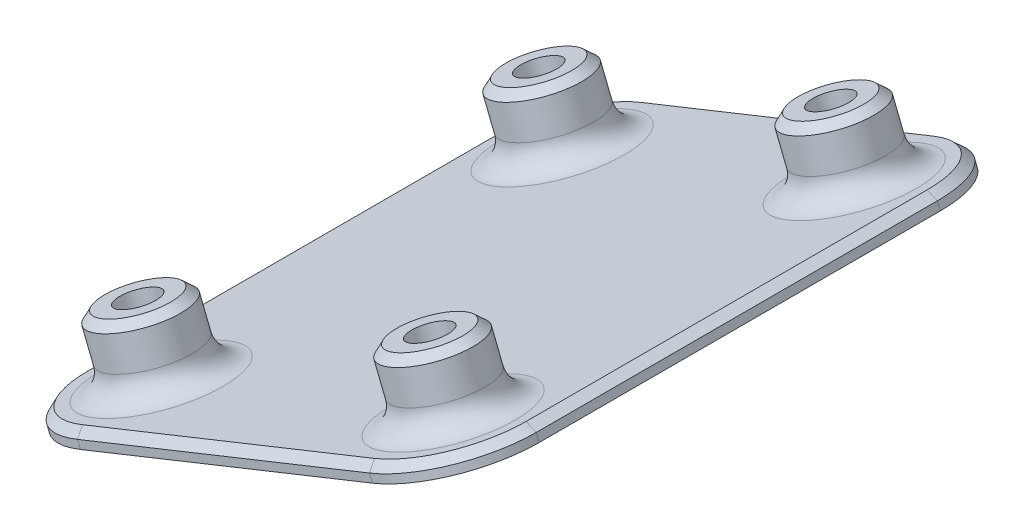
ISO-10303-21;
HEADER;
FILE_DESCRIPTION(('STEP AP214'),'2;1');
FILE_NAME('part.step','',(''),(''),'','','');
FILE_SCHEMA(('AUTOMOTIVE_DESIGN { 1 0 10303 214 1 1 1 1 }'));
ENDSEC;
DATA;
#1=APPLICATION_CONTEXT('core data for automotive mechanical design processes');
#2=APPLICATION_PROTOCOL_DEFINITION('international standard','automotive_design',2000,#1);
#3=PRODUCT_CONTEXT('',#1,'mechanical');
#4=PRODUCT('Part','Part','',(#3));
#5=PRODUCT_RELATED_PRODUCT_CATEGORY('part','',(#4));
#6=PRODUCT_DEFINITION_FORMATION('','',#4);
#7=PRODUCT_DEFINITION_CONTEXT('part definition',#1,'design');
#8=PRODUCT_DEFINITION('design','',#6,#7);
#9=PRODUCT_DEFINITION_SHAPE('','',#8);
#10=(LENGTH_UNIT() NAMED_UNIT(*) SI_UNIT(.MILLI.,.METRE.));
#11=(NAMED_UNIT(*) PLANE_ANGLE_UNIT() SI_UNIT($,.RADIAN.));
#12=(NAMED_UNIT(*) SI_UNIT($,.STERADIAN.) SOLID_ANGLE_UNIT());
#13=UNCERTAINTY_MEASURE_WITH_UNIT(LENGTH_MEASURE(1.E-05),#10,'distance_accuracy_value','');
#14=(GEOMETRIC_REPRESENTATION_CONTEXT(3) GLOBAL_UNCERTAINTY_ASSIGNED_CONTEXT((#13)) GLOBAL_UNIT_ASSIGNED_CONTEXT((#10,
#11,#12)) REPRESENTATION_CONTEXT('',''));
#15=CARTESIAN_POINT('',(0.,0.,0.));
#16=DIRECTION('',(0.,0.,1.));
#17=DIRECTION('',(1.,0.,0.));
#18=AXIS2_PLACEMENT_3D('',#15,#16,#17);
#19=CARTESIAN_POINT('',(1005.38360166364,672.725824874128,25.49999999628));
#20=DIRECTION('',(0.371486563143848,-0.928438330425652,2.53928822413452E-11));
#21=DIRECTION('',(0.928438330425652,0.371486563143848,0.));
#22=AXIS2_PLACEMENT_3D('',#19,#20,#21);
#23=CONICAL_SURFACE('',#22,3.4585,0.785398162499942);
#24=CARTESIAN_POINT('',(1005.38360166364,672.725824874128,25.49999999628));
#25=DIRECTION('',(-0.371486563143805,0.928438330425669,-2.53891440794976E-11));
#26=DIRECTION('',(0.928438330425669,0.371486563143805,0.));
#27=AXIS2_PLACEMENT_3D('',#24,#25,#26);
#28=CIRCLE('',#27,3.4585);
#29=CARTESIAN_POINT('',(1008.59460562942,674.010611152761,25.49999999628));
#30=VERTEX_POINT('',#29);
#31=EDGE_CURVE('E351',#30,#30,#28,.T.);
#32=ORIENTED_EDGE('',*,*,#31,.F.);
#33=EDGE_LOOP('',(#32));
#34=FACE_BOUND('',#33,.T.);
#35=CARTESIAN_POINT('',(1005.0121151005,673.654263204554,25.4999999962546));
#36=DIRECTION('',(0.371486563143832,-0.928438330425658,2.53928822413452E-11));
#37=DIRECTION('',(0.928438330425658,0.371486563143832,0.));
#38=AXIS2_PLACEMENT_3D('',#35,#36,#37);
#39=CIRCLE('',#38,2.4585);
#40=CARTESIAN_POINT('',(1007.29468073585,674.567562920043,25.4999999962546));
#41=VERTEX_POINT('',#40);
#42=EDGE_CURVE('E310',#41,#41,#39,.T.);
#43=ORIENTED_EDGE('',*,*,#42,.F.);
#44=EDGE_LOOP('',(#43));
#45=FACE_BOUND('',#44,.T.);
#46=ADVANCED_FACE('F17',(#34,#45),#23,.F.);
#47=CARTESIAN_POINT('',(1005.38360166388,672.72582487283,-25.50000000371));
#48=DIRECTION('',(0.371486563143848,-0.928438330425652,2.53928822413452E-11));
#49=DIRECTION('',(0.928438330425652,0.371486563143848,0.));
#50=AXIS2_PLACEMENT_3D('',#47,#48,#49);
#51=CONICAL_SURFACE('',#50,3.4585000000001,0.785398162499982);
#52=CARTESIAN_POINT('',(1005.38360166388,672.72582487283,-25.50000000371));
#53=DIRECTION('',(-0.371486563143804,0.928438330425669,-2.53891440794976E-11));
#54=DIRECTION('',(0.928438330425669,0.371486563143804,0.));
#55=AXIS2_PLACEMENT_3D('',#52,#53,#54);
#56=CIRCLE('',#55,3.4585);
#57=CARTESIAN_POINT('',(1008.59460562966,674.010611151463,-25.50000000371));
#58=VERTEX_POINT('',#57);
#59=EDGE_CURVE('E355',#58,#58,#56,.T.);
#60=ORIENTED_EDGE('',*,*,#59,.F.);
#61=EDGE_LOOP('',(#60));
#62=FACE_BOUND('',#61,.T.);
#63=CARTESIAN_POINT('',(1005.01211510074,673.654263203256,-25.5000000037354));
#64=DIRECTION('',(0.371486563143832,-0.928438330425658,2.53928822413452E-11));
#65=DIRECTION('',(0.928438330425658,0.371486563143832,0.));
#66=AXIS2_PLACEMENT_3D('',#63,#64,#65);
#67=CIRCLE('',#66,2.4585);
#68=CARTESIAN_POINT('',(1007.29468073609,674.567562918745,-25.5000000037354));
#69=VERTEX_POINT('',#68);
#70=EDGE_CURVE('E313',#69,#69,#67,.T.);
#71=ORIENTED_EDGE('',*,*,#70,.F.);
#72=EDGE_LOOP('',(#71));
#73=FACE_BOUND('',#72,.T.);
#74=ADVANCED_FACE('F539',(#62,#73),#51,.F.);
#75=CARTESIAN_POINT('',(968.246068447088,657.866362347172,-25.5000000037066));
#76=DIRECTION('',(0.37148656314381,-0.928438330425667,2.53928822413426E-11));
#77=DIRECTION('',(0.928438330425667,0.37148656314381,0.));
#78=AXIS2_PLACEMENT_3D('',#75,#76,#77);
#79=CONICAL_SURFACE('',#78,3.4585,0.785398162499879);
#80=CARTESIAN_POINT('',(968.246068447088,657.866362347172,-25.5000000037066));
#81=DIRECTION('',(-0.371486563143787,0.928438330425676,-2.53891440794976E-11));
#82=DIRECTION('',(0.928438330425676,0.371486563143787,0.));
#83=AXIS2_PLACEMENT_3D('',#80,#81,#82);
#84=CIRCLE('',#83,3.45849999999983);
#85=CARTESIAN_POINT('',(971.457072412865,659.151148625804,-25.5000000037066));
#86=VERTEX_POINT('',#85);
#87=EDGE_CURVE('E127',#86,#86,#84,.T.);
#88=ORIENTED_EDGE('',*,*,#87,.F.);
#89=EDGE_LOOP('',(#88));
#90=FACE_BOUND('',#89,.T.);
#91=CARTESIAN_POINT('',(967.874581883944,658.794800677598,-25.500000003732));
#92=DIRECTION('',(0.371486563143809,-0.928438330425667,2.53928822413426E-11));
#93=DIRECTION('',(0.928438330425667,0.371486563143809,0.));
#94=AXIS2_PLACEMENT_3D('',#91,#92,#93);
#95=CIRCLE('',#94,2.4585);
#96=CARTESIAN_POINT('',(970.157147519296,659.708100393087,-25.500000003732));
#97=VERTEX_POINT('',#96);
#98=EDGE_CURVE('E28',#97,#97,#95,.T.);
#99=ORIENTED_EDGE('',*,*,#98,.F.);
#100=EDGE_LOOP('',(#99));
#101=FACE_BOUND('',#100,.T.);
#102=ADVANCED_FACE('F546',(#90,#101),#79,.F.);
#103=CARTESIAN_POINT('',(968.246068446607,657.866362348374,25.4999999962669));
#104=DIRECTION('',(0.371486563143791,-0.928438330425675,2.53928822413488E-11));
#105=DIRECTION('',(0.928438330425675,0.371486563143791,0.));
#106=AXIS2_PLACEMENT_3D('',#103,#104,#105);
#107=CONICAL_SURFACE('',#106,3.45850000000004,0.785398162500024);
#108=CARTESIAN_POINT('',(968.246068446607,657.866362348374,25.4999999962669));
#109=DIRECTION('',(-0.371486563143793,0.928438330425674,-2.53891440794976E-11));
#110=DIRECTION('',(0.928438330425674,0.371486563143793,0.));
#111=AXIS2_PLACEMENT_3D('',#108,#109,#110);
#112=CIRCLE('',#111,3.45850000000004);
#113=CARTESIAN_POINT('',(971.457072412384,659.151148627007,25.4999999962669));
#114=VERTEX_POINT('',#113);
#115=EDGE_CURVE('E139',#114,#114,#112,.T.);
#116=ORIENTED_EDGE('',*,*,#115,.F.);
#117=EDGE_LOOP('',(#116));
#118=FACE_BOUND('',#117,.T.);
#119=CARTESIAN_POINT('',(967.874581883463,658.7948006788,25.4999999962415));
#120=DIRECTION('',(0.371486563143793,-0.928438330425674,2.53928822413488E-11));
#121=DIRECTION('',(0.928438330425674,0.371486563143793,0.));
#122=AXIS2_PLACEMENT_3D('',#119,#120,#121);
#123=CIRCLE('',#122,2.4585);
#124=CARTESIAN_POINT('',(970.157147518815,659.708100394289,25.4999999962415));
#125=VERTEX_POINT('',#124);
#126=EDGE_CURVE('E11',#125,#125,#123,.T.);
#127=ORIENTED_EDGE('',*,*,#126,.F.);
#128=EDGE_LOOP('',(#127));
#129=FACE_BOUND('',#128,.T.);
#130=ADVANCED_FACE('F619',(#118,#129),#107,.F.);
#131=CARTESIAN_POINT('',(968.246068446607,657.866362348374,25.4999999962669));
#132=DIRECTION('',(-0.371486563143793,0.928438330425674,-2.53912859787212E-11));
#133=DIRECTION('',(-0.928438330425674,-0.371486563143793,0.));
#134=AXIS2_PLACEMENT_3D('',#131,#132,#133);
#135=CYLINDRICAL_SURFACE('',#134,2.4585);
#136=CARTESIAN_POINT('',(964.531202815169,667.150745652631,25.499999996013));
#137=DIRECTION('',(0.371486563143793,-0.928438330425674,2.53912446623872E-11));
#138=DIRECTION('',(0.928438330425674,0.371486563143793,0.));
#139=AXIS2_PLACEMENT_3D('',#136,#137,#138);
#140=CIRCLE('',#139,2.4585);
#141=CARTESIAN_POINT('',(966.81376845052,668.06404536812,25.499999996013));
#142=VERTEX_POINT('',#141);
#143=EDGE_CURVE('E339',#142,#142,#140,.T.);
#144=ORIENTED_EDGE('',*,*,#143,.F.);
#145=EDGE_LOOP('',(#144));
#146=FACE_BOUND('',#145,.T.);
#147=ORIENTED_EDGE('',*,*,#126,.T.);
#148=EDGE_LOOP('',(#147));
#149=FACE_BOUND('',#148,.T.);
#150=ADVANCED_FACE('F616',(#146,#149),#135,.F.);
#151=CARTESIAN_POINT('',(968.246068447088,657.866362347172,-25.5000000037066));
#152=DIRECTION('',(-0.371486563143793,0.928438330425674,-2.53912859787212E-11));
#153=DIRECTION('',(-0.928438330425674,-0.371486563143793,0.));
#154=AXIS2_PLACEMENT_3D('',#151,#152,#153);
#155=CYLINDRICAL_SURFACE('',#154,2.4585);
#156=CARTESIAN_POINT('',(964.53120281565,667.150745651429,-25.5000000039605));
#157=DIRECTION('',(0.371486563143793,-0.928438330425674,2.53912446623872E-11));
#158=DIRECTION('',(0.928438330425674,0.371486563143793,0.));
#159=AXIS2_PLACEMENT_3D('',#156,#157,#158);
#160=CIRCLE('',#159,2.4585);
#161=CARTESIAN_POINT('',(966.813768451001,668.064045366918,-25.5000000039605));
#162=VERTEX_POINT('',#161);
#163=EDGE_CURVE('E309',#162,#162,#160,.T.);
#164=ORIENTED_EDGE('',*,*,#163,.F.);
#165=EDGE_LOOP('',(#164));
#166=FACE_BOUND('',#165,.T.);
#167=ORIENTED_EDGE('',*,*,#98,.T.);
#168=EDGE_LOOP('',(#167));
#169=FACE_BOUND('',#168,.T.);
#170=ADVANCED_FACE('F614',(#166,#169),#155,.F.);
#171=CARTESIAN_POINT('',(1005.38360166388,672.725824872831,-25.50000000371));
#172=DIRECTION('',(-0.371486563143793,0.928438330425674,-2.53912859787212E-11));
#173=DIRECTION('',(-0.928438330425674,-0.371486563143793,0.));
#174=AXIS2_PLACEMENT_3D('',#171,#172,#173);
#175=CYLINDRICAL_SURFACE('',#174,2.4585);
#176=CARTESIAN_POINT('',(1001.66873603244,682.010208177087,-25.5000000039639));
#177=DIRECTION('',(0.371486563143793,-0.928438330425674,2.53912446623872E-11));
#178=DIRECTION('',(0.928438330425674,0.371486563143793,0.));
#179=AXIS2_PLACEMENT_3D('',#176,#177,#178);
#180=CIRCLE('',#179,2.4585);
#181=CARTESIAN_POINT('',(1003.95130166779,682.923507892576,-25.5000000039639));
#182=VERTEX_POINT('',#181);
#183=EDGE_CURVE('E298',#182,#182,#180,.T.);
#184=ORIENTED_EDGE('',*,*,#183,.F.);
#185=EDGE_LOOP('',(#184));
#186=FACE_BOUND('',#185,.T.);
#187=ORIENTED_EDGE('',*,*,#70,.T.);
#188=EDGE_LOOP('',(#187));
#189=FACE_BOUND('',#188,.T.);
#190=ADVANCED_FACE('F611',(#186,#189),#175,.F.);
#191=CARTESIAN_POINT('',(1005.38360166364,672.725824874128,25.49999999628));
#192=DIRECTION('',(-0.371486563143793,0.928438330425674,-2.53912859787212E-11));
#193=DIRECTION('',(-0.928438330425674,-0.371486563143793,0.));
#194=AXIS2_PLACEMENT_3D('',#191,#192,#193);
#195=CYLINDRICAL_SURFACE('',#194,2.4585);
#196=CARTESIAN_POINT('',(1001.6687360322,682.010208178385,25.4999999960261));
#197=DIRECTION('',(0.371486563143793,-0.928438330425674,2.53912446623872E-11));
#198=DIRECTION('',(0.928438330425674,0.371486563143793,0.));
#199=AXIS2_PLACEMENT_3D('',#196,#197,#198);
#200=CIRCLE('',#199,2.4585);
#201=CARTESIAN_POINT('',(1003.95130166755,682.923507893874,25.4999999960261));
#202=VERTEX_POINT('',#201);
#203=EDGE_CURVE('E293',#202,#202,#200,.T.);
#204=ORIENTED_EDGE('',*,*,#203,.F.);
#205=EDGE_LOOP('',(#204));
#206=FACE_BOUND('',#205,.T.);
#207=ORIENTED_EDGE('',*,*,#42,.T.);
#208=EDGE_LOOP('',(#207));
#209=FACE_BOUND('',#208,.T.);
#210=ADVANCED_FACE('F532',(#206,#209),#195,.F.);
#211=CARTESIAN_POINT('',(1002.04022259559,681.081769846662,-25.5000000039385));
#212=DIRECTION('',(0.371486563143695,-0.928438330425713,2.53928822413499E-11));
#213=DIRECTION('',(0.928438330425713,0.371486563143695,0.));
#214=AXIS2_PLACEMENT_3D('',#211,#212,#213);
#215=CONICAL_SURFACE('',#214,5.5,0.785398162500026);
#216=CARTESIAN_POINT('',(1002.04022259559,681.081769846662,-25.5000000039385));
#217=DIRECTION('',(0.371486563143688,-0.928438330425716,2.53928822413499E-11));
#218=DIRECTION('',(0.928438330425716,0.371486563143688,0.));
#219=AXIS2_PLACEMENT_3D('',#216,#217,#218);
#220=CIRCLE('',#219,5.5);
#221=CARTESIAN_POINT('',(1007.14663341293,683.124945943953,-25.5000000039385));
#222=VERTEX_POINT('',#221);
#223=EDGE_CURVE('E308',#222,#222,#220,.T.);
#224=ORIENTED_EDGE('',*,*,#223,.F.);
#225=EDGE_LOOP('',(#224));
#226=FACE_BOUND('',#225,.T.);
#227=CARTESIAN_POINT('',(1001.66873603244,682.010208177088,-25.5000000039639));
#228=DIRECTION('',(-0.371486563143797,0.928438330425672,-2.53912446623872E-11));
#229=DIRECTION('',(0.928438330425672,0.371486563143797,0.));
#230=AXIS2_PLACEMENT_3D('',#227,#228,#229);
#231=CIRCLE('',#230,4.5);
#232=CARTESIAN_POINT('',(1005.84670851936,683.681897711235,-25.5000000039639));
#233=VERTEX_POINT('',#232);
#234=EDGE_CURVE('E294',#233,#233,#231,.T.);
#235=ORIENTED_EDGE('',*,*,#234,.F.);
#236=EDGE_LOOP('',(#235));
#237=FACE_BOUND('',#236,.T.);
#238=ADVANCED_FACE('F520',(#226,#237),#215,.T.);
#239=CARTESIAN_POINT('',(1002.04022259534,681.081769847959,25.4999999960516));
#240=DIRECTION('',(0.371486563143695,-0.928438330425713,2.53928822413499E-11));
#241=DIRECTION('',(0.928438330425713,0.371486563143695,0.));
#242=AXIS2_PLACEMENT_3D('',#239,#240,#241);
#243=CONICAL_SURFACE('',#242,5.5,0.785398162500026);
#244=CARTESIAN_POINT('',(1002.04022259534,681.081769847959,25.4999999960516));
#245=DIRECTION('',(0.371486563143688,-0.928438330425716,2.53928822413499E-11));
#246=DIRECTION('',(0.928438330425716,0.371486563143688,0.));
#247=AXIS2_PLACEMENT_3D('',#244,#245,#246);
#248=CIRCLE('',#247,5.5);
#249=CARTESIAN_POINT('',(1007.14663341269,683.124945945249,25.4999999960516));
#250=VERTEX_POINT('',#249);
#251=EDGE_CURVE('E363',#250,#250,#248,.T.);
#252=ORIENTED_EDGE('',*,*,#251,.F.);
#253=EDGE_LOOP('',(#252));
#254=FACE_BOUND('',#253,.T.);
#255=CARTESIAN_POINT('',(1001.6687360322,682.010208178384,25.4999999960263));
#256=DIRECTION('',(-0.371486563143797,0.928438330425672,-2.53912446623872E-11));
#257=DIRECTION('',(0.928438330425672,0.371486563143797,0.));
#258=AXIS2_PLACEMENT_3D('',#255,#256,#257);
#259=CIRCLE('',#258,4.5);
#260=CARTESIAN_POINT('',(1005.84670851912,683.681897712531,25.4999999960263));
#261=VERTEX_POINT('',#260);
#262=EDGE_CURVE('E289',#261,#261,#259,.T.);
#263=ORIENTED_EDGE('',*,*,#262,.F.);
#264=EDGE_LOOP('',(#263));
#265=FACE_BOUND('',#264,.T.);
#266=ADVANCED_FACE('F517',(#254,#265),#243,.T.);
#267=CARTESIAN_POINT('',(964.902689378313,666.222307322205,25.4999999960383));
#268=DIRECTION('',(0.371486563143791,-0.928438330425675,2.53928822413488E-11));
#269=DIRECTION('',(0.928438330425675,0.371486563143791,0.));
#270=AXIS2_PLACEMENT_3D('',#267,#268,#269);
#271=CONICAL_SURFACE('',#270,5.5,0.785398162500003);
#272=CARTESIAN_POINT('',(964.902689378313,666.222307322205,25.4999999960383));
#273=DIRECTION('',(0.371486563143796,-0.928438330425673,2.53928822413488E-11));
#274=DIRECTION('',(0.928438330425673,0.371486563143796,0.));
#275=AXIS2_PLACEMENT_3D('',#272,#273,#274);
#276=CIRCLE('',#275,5.5);
#277=CARTESIAN_POINT('',(970.009100195654,668.265483419496,25.4999999960383));
#278=VERTEX_POINT('',#277);
#279=EDGE_CURVE('E284',#278,#278,#276,.T.);
#280=ORIENTED_EDGE('',*,*,#279,.F.);
#281=EDGE_LOOP('',(#280));
#282=FACE_BOUND('',#281,.T.);
#283=CARTESIAN_POINT('',(964.531202815169,667.150745652631,25.4999999960129));
#284=DIRECTION('',(-0.371486563143797,0.928438330425672,-2.53912446623872E-11));
#285=DIRECTION('',(0.928438330425672,0.371486563143797,0.));
#286=AXIS2_PLACEMENT_3D('',#283,#284,#285);
#287=CIRCLE('',#286,4.5);
#288=CARTESIAN_POINT('',(968.709175302084,668.822435186778,25.4999999960129));
#289=VERTEX_POINT('',#288);
#290=EDGE_CURVE('E342',#289,#289,#287,.T.);
#291=ORIENTED_EDGE('',*,*,#290,.F.);
#292=EDGE_LOOP('',(#291));
#293=FACE_BOUND('',#292,.T.);
#294=ADVANCED_FACE('F519',(#282,#293),#271,.T.);
#295=CARTESIAN_POINT('',(964.902689378793,666.222307321003,-25.500000003935));
#296=DIRECTION('',(0.371486563143791,-0.928438330425675,2.53928822413488E-11));
#297=DIRECTION('',(0.928438330425675,0.371486563143791,0.));
#298=AXIS2_PLACEMENT_3D('',#295,#296,#297);
#299=CONICAL_SURFACE('',#298,5.5,0.785398162500003);
#300=CARTESIAN_POINT('',(964.902689378793,666.222307321003,-25.500000003935));
#301=DIRECTION('',(0.371486563143796,-0.928438330425673,2.53928822413488E-11));
#302=DIRECTION('',(0.928438330425673,0.371486563143796,0.));
#303=AXIS2_PLACEMENT_3D('',#300,#301,#302);
#304=CIRCLE('',#303,5.5);
#305=CARTESIAN_POINT('',(970.009100196135,668.265483418294,-25.500000003935));
#306=VERTEX_POINT('',#305);
#307=EDGE_CURVE('E348',#306,#306,#304,.T.);
#308=ORIENTED_EDGE('',*,*,#307,.F.);
#309=EDGE_LOOP('',(#308));
#310=FACE_BOUND('',#309,.T.);
#311=CARTESIAN_POINT('',(964.53120281565,667.150745651429,-25.5000000039604));
#312=DIRECTION('',(-0.371486563143797,0.928438330425672,-2.53912446623872E-11));
#313=DIRECTION('',(0.928438330425672,0.371486563143797,0.));
#314=AXIS2_PLACEMENT_3D('',#311,#312,#313);
#315=CIRCLE('',#314,4.5);
#316=CARTESIAN_POINT('',(968.709175302565,668.822435185576,-25.5000000039604));
#317=VERTEX_POINT('',#316);
#318=EDGE_CURVE('E305',#317,#317,#315,.T.);
#319=ORIENTED_EDGE('',*,*,#318,.F.);
#320=EDGE_LOOP('',(#319));
#321=FACE_BOUND('',#320,.T.);
#322=ADVANCED_FACE('F529',(#310,#321),#299,.T.);
#323=CARTESIAN_POINT('',(1015.22493673552,677.740615397578,-36.5000000037452));
#324=DIRECTION('',(0.393824371438796,0.919185707276195,-1.79546900328531E-11));
#325=DIRECTION('',(-4.55906016360988E-11,0.,-1.));
#326=AXIS2_PLACEMENT_3D('',#323,#324,#325);
#327=PLANE('',#326);
#328=DIRECTION('',(-0.919185707276048,0.393824371439136,-1.79505726877873E-11));
#329=VECTOR('',#328,1.);
#330=CARTESIAN_POINT('',(1015.22493673542,677.740615397837,-25.5000000037453));
#331=LINE('',#330,#329);
#332=CARTESIAN_POINT('',(1015.22493673542,677.740615397837,-25.5000000037453));
#333=VERTEX_POINT('',#332);
#334=CARTESIAN_POINT('',(1013.92501184185,678.29756716512,-25.5000000037707));
#335=VERTEX_POINT('',#334);
#336=EDGE_CURVE('E255',#333,#335,#331,.T.);
#337=ORIENTED_EDGE('',*,*,#336,.T.);
#338=DIRECTION('',(9.42929144202188E-12,-2.35732286050547E-11,-1.));
#339=VECTOR('',#338,1.);
#340=CARTESIAN_POINT('',(1013.92501184185,678.29756716512,-25.5000000037707));
#341=LINE('',#340,#339);
#342=CARTESIAN_POINT('',(1013.92501184137,678.297567166322,25.4999999962293));
#343=VERTEX_POINT('',#342);
#344=EDGE_CURVE('E266',#343,#335,#341,.T.);
#345=ORIENTED_EDGE('',*,*,#344,.F.);
#346=DIRECTION('',(0.919185707276247,-0.393824371438672,1.79505726878127E-11));
#347=VECTOR('',#346,1.);
#348=CARTESIAN_POINT('',(1013.92501184137,678.297567166322,25.4999999962293));
#349=LINE('',#348,#347);
#350=CARTESIAN_POINT('',(1015.22493673494,677.740615399041,25.4999999962547));
#351=VERTEX_POINT('',#350);
#352=EDGE_CURVE('E261',#343,#351,#349,.T.);
#353=ORIENTED_EDGE('',*,*,#352,.T.);
#354=DIRECTION('',(-9.42929144202188E-12,2.35732286050547E-11,1.));
#355=VECTOR('',#354,1.);
#356=CARTESIAN_POINT('',(1015.22493673494,677.74061539904,25.4999999962547));
#357=LINE('',#356,#355);
#358=EDGE_CURVE('E333',#333,#351,#357,.T.);
#359=ORIENTED_EDGE('',*,*,#358,.F.);
#360=EDGE_LOOP('',(#337,#345,#353,#359));
#361=FACE_BOUND('',#360,.T.);
#362=ADVANCED_FACE('F607',(#361),#327,.T.);
#363=CARTESIAN_POINT('',(1004.64062853711,674.582701534884,25.4999999962294));
#364=DIRECTION('',(0.371486563143886,-0.928438330425637,2.53928822413478E-11));
#365=DIRECTION('',(0.928438330425637,0.371486563143887,0.));
#366=AXIS2_PLACEMENT_3D('',#363,#364,#365);
#367=CONICAL_SURFACE('',#366,9.99999999999987,0.785398162500051);
#368=DIRECTION('',(-0.262680667911983,0.65650503934086,-0.707106781204487));
#369=VECTOR('',#368,1.);
#370=CARTESIAN_POINT('',(1004.64062853702,674.58270153512,35.4999999962294));
#371=LINE('',#370,#369);
#372=CARTESIAN_POINT('',(1005.01211510015,673.654263204718,36.4999999962548));
#373=VERTEX_POINT('',#372);
#374=CARTESIAN_POINT('',(1004.64062853702,674.58270153512,35.4999999962302));
#375=VERTEX_POINT('',#374);
#376=EDGE_CURVE('E241',#373,#375,#371,.T.);
#377=ORIENTED_EDGE('',*,*,#376,.F.);
#378=CARTESIAN_POINT('',(1005.01211510026,673.654263204458,25.4999999962548));
#379=DIRECTION('',(0.371486563143888,-0.928438330425636,2.53928822413478E-11));
#380=DIRECTION('',(0.928438330425636,0.371486563143888,0.));
#381=AXIS2_PLACEMENT_3D('',#378,#379,#380);
#382=CIRCLE('',#381,11.);
#383=EDGE_CURVE('E343',#351,#373,#382,.T.);
#384=ORIENTED_EDGE('',*,*,#383,.F.);
#385=ORIENTED_EDGE('',*,*,#352,.F.);
#386=CARTESIAN_POINT('',(1004.64062853711,674.582701534884,25.4999999962294));
#387=DIRECTION('',(-0.371486563143788,0.928438330425676,-2.53891440794976E-11));
#388=DIRECTION('',(0.928438330425676,0.371486563143788,0.));
#389=AXIS2_PLACEMENT_3D('',#386,#387,#388);
#390=CIRCLE('',#389,10.0000000000008);
#391=EDGE_CURVE('E259',#375,#343,#390,.T.);
#392=ORIENTED_EDGE('',*,*,#391,.F.);
#393=EDGE_LOOP('',(#377,#384,#385,#392));
#394=FACE_BOUND('',#393,.T.);
#395=ADVANCED_FACE('F260',(#394),#367,.T.);
#396=CARTESIAN_POINT('',(1004.64062853759,674.582701533682,-25.5000000037706));
#397=DIRECTION('',(0.371486563143733,-0.928438330425698,2.53928822413525E-11));
#398=DIRECTION('',(0.928438330425698,0.371486563143733,0.));
#399=AXIS2_PLACEMENT_3D('',#396,#397,#398);
#400=CONICAL_SURFACE('',#399,10.,0.785398162500078);
#401=DIRECTION('',(-0.262680667925198,0.656505039374133,0.707106781168686));
#402=VECTOR('',#401,1.);
#403=CARTESIAN_POINT('',(1005.01211510084,673.654263202997,-36.5000000037452));
#404=LINE('',#403,#402);
#405=CARTESIAN_POINT('',(1005.01211510084,673.654263202997,-36.5000000037452));
#406=VERTEX_POINT('',#405);
#407=CARTESIAN_POINT('',(1004.64062853769,674.582701533446,-35.5000000037706));
#408=VERTEX_POINT('',#407);
#409=EDGE_CURVE('E256',#406,#408,#404,.T.);
#410=ORIENTED_EDGE('',*,*,#409,.T.);
#411=CARTESIAN_POINT('',(1004.64062853759,674.582701533682,-25.5000000037706));
#412=DIRECTION('',(-0.3714865631438,0.928438330425671,-2.53891440794976E-11));
#413=DIRECTION('',(0.928438330425671,0.3714865631438,0.));
#414=AXIS2_PLACEMENT_3D('',#411,#412,#413);
#415=CIRCLE('',#414,10.);
#416=EDGE_CURVE('E304',#335,#408,#415,.T.);
#417=ORIENTED_EDGE('',*,*,#416,.F.);
#418=ORIENTED_EDGE('',*,*,#336,.F.);
#419=CARTESIAN_POINT('',(1005.01211510074,673.654263203256,-25.5000000037452));
#420=DIRECTION('',(0.371486563143737,-0.928438330425697,2.53928822413525E-11));
#421=DIRECTION('',(0.928438330425697,0.371486563143737,0.));
#422=AXIS2_PLACEMENT_3D('',#419,#420,#421);
#423=CIRCLE('',#422,11.);
#424=EDGE_CURVE('E347',#406,#333,#423,.T.);
#425=ORIENTED_EDGE('',*,*,#424,.F.);
#426=EDGE_LOOP('',(#410,#417,#418,#425));
#427=FACE_BOUND('',#426,.T.);
#428=ADVANCED_FACE('F601',(#427),#400,.T.);
#429=CARTESIAN_POINT('',(1015.22493673484,677.740615399299,36.4999999962548));
#430=DIRECTION('',(-0.262680667925321,0.656505039374152,0.707106781168623));
#431=DIRECTION('',(0.928438330425673,0.371486563143795,0.));
#432=AXIS2_PLACEMENT_3D('',#429,#430,#431);
#433=PLANE('',#432);
#434=DIRECTION('',(-0.262680667911994,0.656505039340809,-0.707106781204531));
#435=VECTOR('',#434,1.);
#436=CARTESIAN_POINT('',(967.503095326596,659.72323901201,35.4999999962294));
#437=LINE('',#436,#435);
#438=CARTESIAN_POINT('',(967.874581889731,658.794800681608,36.4999999962548));
#439=VERTEX_POINT('',#438);
#440=CARTESIAN_POINT('',(967.503095326596,659.72323901201,35.4999999962294));
#441=VERTEX_POINT('',#440);
#442=EDGE_CURVE('E314',#439,#441,#437,.T.);
#443=ORIENTED_EDGE('',*,*,#442,.F.);
#444=DIRECTION('',(-0.928438330425673,-0.371486563143795,0.));
#445=VECTOR('',#444,1.);
#446=CARTESIAN_POINT('',(967.874581889731,658.794800681608,36.4999999962548));
#447=LINE('',#446,#445);
#448=EDGE_CURVE('E249',#373,#439,#447,.T.);
#449=ORIENTED_EDGE('',*,*,#448,.F.);
#450=ORIENTED_EDGE('',*,*,#376,.T.);
#451=DIRECTION('',(0.928438330425673,0.371486563143795,0.));
#452=VECTOR('',#451,1.);
#453=CARTESIAN_POINT('',(1004.64062853702,674.58270153512,35.4999999962294));
#454=LINE('',#453,#452);
#455=EDGE_CURVE('E246',#441,#375,#454,.T.);
#456=ORIENTED_EDGE('',*,*,#455,.F.);
#457=EDGE_LOOP('',(#443,#449,#450,#456));
#458=FACE_BOUND('',#457,.T.);
#459=ADVANCED_FACE('F244',(#458),#433,.T.);
#460=CARTESIAN_POINT('',(957.661760255737,654.708448485306,-36.5000000037452));
#461=DIRECTION('',(-0.262680667912017,0.656505039340901,-0.707106781204437));
#462=DIRECTION('',(-0.937407527146207,0.,0.348234300507049));
#463=AXIS2_PLACEMENT_3D('',#460,#461,#462);
#464=PLANE('',#463);
#465=DIRECTION('',(-0.262680667925472,0.656505039374583,0.707106781168167));
#466=VECTOR('',#465,1.);
#467=CARTESIAN_POINT('',(967.874581890419,658.794800679887,-36.5000000037452));
#468=LINE('',#467,#466);
#469=CARTESIAN_POINT('',(967.874581890419,658.794800679887,-36.5000000037452));
#470=VERTEX_POINT('',#469);
#471=CARTESIAN_POINT('',(967.503095327266,659.723239010337,-35.5000000037718));
#472=VERTEX_POINT('',#471);
#473=EDGE_CURVE('E317',#470,#472,#468,.T.);
#474=ORIENTED_EDGE('',*,*,#473,.T.);
#475=DIRECTION('',(-0.928438330425673,-0.371486563143795,0.));
#476=VECTOR('',#475,1.);
#477=CARTESIAN_POINT('',(967.503095327266,659.723239010337,-35.5000000037706));
#478=LINE('',#477,#476);
#479=EDGE_CURVE('E299',#408,#472,#478,.T.);
#480=ORIENTED_EDGE('',*,*,#479,.F.);
#481=ORIENTED_EDGE('',*,*,#409,.F.);
#482=DIRECTION('',(0.928438330425673,0.371486563143795,0.));
#483=VECTOR('',#482,1.);
#484=CARTESIAN_POINT('',(1005.01211510084,673.654263202997,-36.5000000037452));
#485=LINE('',#484,#483);
#486=EDGE_CURVE('E384',#470,#406,#485,.T.);
#487=ORIENTED_EDGE('',*,*,#486,.F.);
#488=EDGE_LOOP('',(#474,#480,#481,#487));
#489=FACE_BOUND('',#488,.T.);
#490=ADVANCED_FACE('F628',(#489),#464,.T.);
#491=CARTESIAN_POINT('',(967.503095326691,659.723239011775,25.4999999962294));
#492=DIRECTION('',(0.371486563143791,-0.928438330425675,2.53928822413488E-11));
#493=DIRECTION('',(0.928438330425675,0.371486563143791,0.));
#494=AXIS2_PLACEMENT_3D('',#491,#492,#493);
#495=CONICAL_SURFACE('',#494,10.,0.785398162500005);
#496=DIRECTION('',(-0.39382437143889,-0.919185707276154,1.79530259572607E-11));
#497=VECTOR('',#496,1.);
#498=CARTESIAN_POINT('',(958.218712022434,656.008373380337,25.4999999962294));
#499=LINE('',#498,#497);
#500=CARTESIAN_POINT('',(958.218712022434,656.008373380337,25.4999999962294));
#501=VERTEX_POINT('',#500);
#502=CARTESIAN_POINT('',(957.661760255152,654.708448486767,25.4999999962548));
#503=VERTEX_POINT('',#502);
#504=EDGE_CURVE('E379',#501,#503,#499,.T.);
#505=ORIENTED_EDGE('',*,*,#504,.T.);
#506=CARTESIAN_POINT('',(967.874581889834,658.794800681349,25.4999999962548));
#507=DIRECTION('',(0.371486563143787,-0.928438330425676,2.53928822413488E-11));
#508=DIRECTION('',(0.928438330425676,0.371486563143787,0.));
#509=AXIS2_PLACEMENT_3D('',#506,#507,#508);
#510=CIRCLE('',#509,11.);
#511=EDGE_CURVE('E346',#439,#503,#510,.T.);
#512=ORIENTED_EDGE('',*,*,#511,.F.);
#513=ORIENTED_EDGE('',*,*,#442,.T.);
#514=CARTESIAN_POINT('',(967.503095326691,659.723239011775,25.4999999962294));
#515=DIRECTION('',(-0.371486563143796,0.928438330425672,-2.53891440794976E-11));
#516=DIRECTION('',(0.928438330425672,0.371486563143796,0.));
#517=AXIS2_PLACEMENT_3D('',#514,#515,#516);
#518=CIRCLE('',#517,10.);
#519=EDGE_CURVE('E271',#501,#441,#518,.T.);
#520=ORIENTED_EDGE('',*,*,#519,.F.);
#521=EDGE_LOOP('',(#505,#512,#513,#520));
#522=FACE_BOUND('',#521,.T.);
#523=ADVANCED_FACE('F499',(#522),#495,.T.);
#524=CARTESIAN_POINT('',(967.503095327172,659.723239010572,-25.5000000037706));
#525=DIRECTION('',(0.371486563143695,-0.928438330425713,2.53928822413499E-11));
#526=DIRECTION('',(0.928438330425713,0.371486563143695,0.));
#527=AXIS2_PLACEMENT_3D('',#524,#525,#526);
#528=CONICAL_SURFACE('',#527,10.,0.785398162499998);
#529=DIRECTION('',(-0.393824371438824,-0.919185707276182,1.79530259572612E-11));
#530=VECTOR('',#529,1.);
#531=CARTESIAN_POINT('',(957.661760255633,654.708448485565,-25.5000000037453));
#532=LINE('',#531,#530);
#533=CARTESIAN_POINT('',(958.218712022915,656.008373379135,-25.5000000037706));
#534=VERTEX_POINT('',#533);
#535=CARTESIAN_POINT('',(957.661760255633,654.708448485565,-25.5000000037453));
#536=VERTEX_POINT('',#535);
#537=EDGE_CURVE('E387',#534,#536,#532,.T.);
#538=ORIENTED_EDGE('',*,*,#537,.F.);
#539=CARTESIAN_POINT('',(967.503095327172,659.723239010572,-25.5000000037706));
#540=DIRECTION('',(-0.371486563143797,0.928438330425672,-2.53891440794976E-11));
#541=DIRECTION('',(0.928438330425672,0.371486563143797,0.));
#542=AXIS2_PLACEMENT_3D('',#539,#540,#541);
#543=CIRCLE('',#542,10.0000000000011);
#544=EDGE_CURVE('E303',#472,#534,#543,.T.);
#545=ORIENTED_EDGE('',*,*,#544,.F.);
#546=ORIENTED_EDGE('',*,*,#473,.F.);
#547=CARTESIAN_POINT('',(967.874581890315,658.794800680147,-25.5000000037453));
#548=DIRECTION('',(0.371486563143695,-0.928438330425713,2.53928822413499E-11));
#549=DIRECTION('',(0.928438330425713,0.371486563143695,0.));
#550=AXIS2_PLACEMENT_3D('',#547,#548,#549);
#551=CIRCLE('',#550,11.);
#552=EDGE_CURVE('E297',#536,#470,#551,.T.);
#553=ORIENTED_EDGE('',*,*,#552,.F.);
#554=EDGE_LOOP('',(#538,#545,#546,#553));
#555=FACE_BOUND('',#554,.T.);
#556=ADVANCED_FACE('F572',(#555),#528,.T.);
#557=CARTESIAN_POINT('',(957.661760255048,654.708448487026,36.4999999962548));
#558=DIRECTION('',(-0.919185707276158,0.393824371438881,-1.79525792585355E-11));
#559=DIRECTION('',(-1.95309599751444E-11,0.,1.));
#560=AXIS2_PLACEMENT_3D('',#557,#558,#559);
#561=PLANE('',#560);
#562=ORIENTED_EDGE('',*,*,#504,.F.);
#563=DIRECTION('',(-9.43138884053602E-12,2.35723893943715E-11,1.));
#564=VECTOR('',#563,1.);
#565=CARTESIAN_POINT('',(958.218712022434,656.008373380337,25.4999999962294));
#566=LINE('',#565,#564);
#567=EDGE_CURVE('E473',#534,#501,#566,.T.);
#568=ORIENTED_EDGE('',*,*,#567,.F.);
#569=ORIENTED_EDGE('',*,*,#537,.T.);
#570=DIRECTION('',(9.43138884053602E-12,-2.35723893943715E-11,-1.));
#571=VECTOR('',#570,1.);
#572=CARTESIAN_POINT('',(957.661760255633,654.708448485565,-25.5000000037452));
#573=LINE('',#572,#571);
#574=EDGE_CURVE('E338',#503,#536,#573,.T.);
#575=ORIENTED_EDGE('',*,*,#574,.F.);
#576=EDGE_LOOP('',(#562,#568,#569,#575));
#577=FACE_BOUND('',#576,.T.);
#578=ADVANCED_FACE('F575',(#577),#561,.T.);
#579=CARTESIAN_POINT('',(1003.52616884816,677.368016524959,-25.500000003837));
#580=DIRECTION('',(0.37148656314379,-0.928438330425675,2.53891440794976E-11));
#581=DIRECTION('',(0.928438330425675,0.37148656314379,0.));
#582=AXIS2_PLACEMENT_3D('',#579,#580,#581);
#583=TOROIDAL_SURFACE('',#582,8.5,3.);
#584=CARTESIAN_POINT('',(1004.6406285376,674.582701533682,-25.5000000037608));
#585=DIRECTION('',(0.371486563143794,-0.928438330425673,2.53891440794976E-11));
#586=DIRECTION('',(0.928438330425673,0.371486563143794,0.));
#587=AXIS2_PLACEMENT_3D('',#584,#585,#586);
#588=CIRCLE('',#587,8.5);
#589=CARTESIAN_POINT('',(1012.53235434621,677.740337320404,-25.5000000037608));
#590=VERTEX_POINT('',#589);
#591=EDGE_CURVE('E323',#590,#590,#588,.T.);
#592=ORIENTED_EDGE('',*,*,#591,.F.);
#593=EDGE_LOOP('',(#592));
#594=FACE_BOUND('',#593,.T.);
#595=CARTESIAN_POINT('',(1003.52616884816,677.368016524959,-25.500000003837));
#596=DIRECTION('',(-0.371486563143803,0.92843833042567,-2.53891440794976E-11));
#597=DIRECTION('',(0.92843833042567,0.371486563143803,0.));
#598=AXIS2_PLACEMENT_3D('',#595,#596,#597);
#599=CIRCLE('',#598,5.5);
#600=CARTESIAN_POINT('',(1008.6325796655,679.41119262225,-25.500000003837));
#601=VERTEX_POINT('',#600);
#602=EDGE_CURVE('E428',#601,#601,#599,.T.);
#603=ORIENTED_EDGE('',*,*,#602,.F.);
#604=EDGE_LOOP('',(#603));
#605=FACE_BOUND('',#604,.T.);
#606=ADVANCED_FACE('F593',(#594,#605),#583,.F.);
#607=CARTESIAN_POINT('',(1003.52616884792,677.368016526256,25.4999999961532));
#608=DIRECTION('',(0.37148656314379,-0.928438330425675,2.53891440794976E-11));
#609=DIRECTION('',(0.928438330425675,0.37148656314379,0.));
#610=AXIS2_PLACEMENT_3D('',#607,#608,#609);
#611=TOROIDAL_SURFACE('',#610,8.5,3.);
#612=CARTESIAN_POINT('',(1004.64062853735,674.582701534979,25.4999999962294));
#613=DIRECTION('',(0.371486563143794,-0.928438330425673,2.53891440794976E-11));
#614=DIRECTION('',(0.928438330425673,0.371486563143794,0.));
#615=AXIS2_PLACEMENT_3D('',#612,#613,#614);
#616=CIRCLE('',#615,8.5);
#617=CARTESIAN_POINT('',(1012.53235434597,677.740337321701,25.4999999962294));
#618=VERTEX_POINT('',#617);
#619=EDGE_CURVE('E320',#618,#618,#616,.T.);
#620=ORIENTED_EDGE('',*,*,#619,.F.);
#621=EDGE_LOOP('',(#620));
#622=FACE_BOUND('',#621,.T.);
#623=CARTESIAN_POINT('',(1003.52616884792,677.368016526256,25.4999999961532));
#624=DIRECTION('',(-0.371486563143789,0.928438330425675,-2.53891440794976E-11));
#625=DIRECTION('',(0.928438330425675,0.371486563143789,0.));
#626=AXIS2_PLACEMENT_3D('',#623,#624,#625);
#627=CIRCLE('',#626,5.5);
#628=CARTESIAN_POINT('',(1008.63257966526,679.411192623547,25.4999999961532));
#629=VERTEX_POINT('',#628);
#630=EDGE_CURVE('E365',#629,#629,#627,.T.);
#631=ORIENTED_EDGE('',*,*,#630,.F.);
#632=EDGE_LOOP('',(#631));
#633=FACE_BOUND('',#632,.T.);
#634=ADVANCED_FACE('F596',(#622,#633),#611,.F.);
#635=CARTESIAN_POINT('',(966.388635630888,662.508554000502,25.4999999961399));
#636=DIRECTION('',(0.37148656314379,-0.928438330425675,2.53891440794976E-11));
#637=DIRECTION('',(0.928438330425675,0.37148656314379,0.));
#638=AXIS2_PLACEMENT_3D('',#635,#636,#637);
#639=TOROIDAL_SURFACE('',#638,8.5,3.);
#640=CARTESIAN_POINT('',(967.503095320319,659.723239009225,25.4999999962161));
#641=DIRECTION('',(0.371486563143794,-0.928438330425673,2.53891440794976E-11));
#642=DIRECTION('',(0.928438330425673,0.371486563143794,0.));
#643=AXIS2_PLACEMENT_3D('',#640,#641,#642);
#644=CIRCLE('',#643,8.5);
#645=CARTESIAN_POINT('',(975.394821128937,662.880874795948,25.4999999962161));
#646=VERTEX_POINT('',#645);
#647=EDGE_CURVE('E324',#646,#646,#644,.T.);
#648=ORIENTED_EDGE('',*,*,#647,.F.);
#649=EDGE_LOOP('',(#648));
#650=FACE_BOUND('',#649,.T.);
#651=CARTESIAN_POINT('',(966.388635630888,662.508554000502,25.4999999961399));
#652=DIRECTION('',(-0.371486563143796,0.928438330425673,-2.53891440794976E-11));
#653=DIRECTION('',(0.928438330425673,0.371486563143796,0.));
#654=AXIS2_PLACEMENT_3D('',#651,#652,#653);
#655=CIRCLE('',#654,5.5);
#656=CARTESIAN_POINT('',(971.495046448229,664.551730097793,25.4999999961399));
#657=VERTEX_POINT('',#656);
#658=EDGE_CURVE('E288',#657,#657,#655,.T.);
#659=ORIENTED_EDGE('',*,*,#658,.F.);
#660=EDGE_LOOP('',(#659));
#661=FACE_BOUND('',#660,.T.);
#662=ADVANCED_FACE('F591',(#650,#661),#639,.F.);
#663=CARTESIAN_POINT('',(966.388635631369,662.5085539993,-25.5000000038334));
#664=DIRECTION('',(0.37148656314379,-0.928438330425675,2.53891440794976E-11));
#665=DIRECTION('',(0.928438330425675,0.37148656314379,0.));
#666=AXIS2_PLACEMENT_3D('',#663,#664,#665);
#667=TOROIDAL_SURFACE('',#666,8.5,3.);
#668=CARTESIAN_POINT('',(967.5030953208,659.723239008023,-25.5000000037572));
#669=DIRECTION('',(0.371486563143794,-0.928438330425673,2.53891440794976E-11));
#670=DIRECTION('',(0.928438330425673,0.371486563143794,0.));
#671=AXIS2_PLACEMENT_3D('',#668,#669,#670);
#672=CIRCLE('',#671,8.5);
#673=CARTESIAN_POINT('',(975.394821129418,662.880874794745,-25.5000000037572));
#674=VERTEX_POINT('',#673);
#675=EDGE_CURVE('E370',#674,#674,#672,.T.);
#676=ORIENTED_EDGE('',*,*,#675,.F.);
#677=EDGE_LOOP('',(#676));
#678=FACE_BOUND('',#677,.T.);
#679=CARTESIAN_POINT('',(966.388635631369,662.5085539993,-25.5000000038334));
#680=DIRECTION('',(-0.371486563143796,0.928438330425673,-2.53891440794976E-11));
#681=DIRECTION('',(0.928438330425673,0.371486563143796,0.));
#682=AXIS2_PLACEMENT_3D('',#679,#680,#681);
#683=CIRCLE('',#682,5.5);
#684=CARTESIAN_POINT('',(971.49504644871,664.551730096591,-25.5000000038334));
#685=VERTEX_POINT('',#684);
#686=EDGE_CURVE('E327',#685,#685,#683,.T.);
#687=ORIENTED_EDGE('',*,*,#686,.F.);
#688=EDGE_LOOP('',(#687));
#689=FACE_BOUND('',#688,.T.);
#690=ADVANCED_FACE('F588',(#678,#689),#667,.F.);
#691=CARTESIAN_POINT('',(967.503095326691,659.723239011775,25.4999999962294));
#692=DIRECTION('',(0.371486563143796,-0.928438330425673,2.53912165620599E-11));
#693=DIRECTION('',(0.928438330425673,0.371486563143796,0.));
#694=AXIS2_PLACEMENT_3D('',#691,#692,#693);
#695=CYLINDRICAL_SURFACE('',#694,11.);
#696=DIRECTION('',(0.371486563143796,-0.928438330425673,2.53912165620599E-11));
#697=VECTOR('',#696,1.);
#698=CARTESIAN_POINT('',(967.503095326587,659.723239012034,36.4999999962294));
#699=LINE('',#698,#697);
#700=CARTESIAN_POINT('',(968.246068452874,657.866362351183,36.4999999962801));
#701=VERTEX_POINT('',#700);
#702=EDGE_CURVE('E356',#439,#701,#699,.T.);
#703=ORIENTED_EDGE('',*,*,#702,.F.);
#704=ORIENTED_EDGE('',*,*,#511,.T.);
#705=DIRECTION('',(-0.371486563143796,0.928438330425673,-2.53912165620599E-11));
#706=VECTOR('',#705,1.);
#707=CARTESIAN_POINT('',(957.290273692008,655.636886817193,25.4999999962294));
#708=LINE('',#707,#706);
#709=CARTESIAN_POINT('',(958.033246818296,653.780010156342,25.4999999962802));
#710=VERTEX_POINT('',#709);
#711=EDGE_CURVE('E334',#710,#503,#708,.T.);
#712=ORIENTED_EDGE('',*,*,#711,.F.);
#713=CARTESIAN_POINT('',(968.246068452978,657.866362350923,25.4999999962801));
#714=DIRECTION('',(0.371486563143796,-0.928438330425673,2.53891440794976E-11));
#715=DIRECTION('',(0.928438330425673,0.371486563143796,0.));
#716=AXIS2_PLACEMENT_3D('',#713,#714,#715);
#717=CIRCLE('',#716,11.);
#718=EDGE_CURVE('E360',#701,#710,#717,.T.);
#719=ORIENTED_EDGE('',*,*,#718,.F.);
#720=EDGE_LOOP('',(#703,#704,#712,#719));
#721=FACE_BOUND('',#720,.T.);
#722=ADVANCED_FACE('F583',(#721),#695,.T.);
#723=CARTESIAN_POINT('',(1004.64062853711,674.582701534884,25.4999999962294));
#724=DIRECTION('',(0.371486563143796,-0.928438330425673,2.53912165620599E-11));
#725=DIRECTION('',(0.928438330425673,0.371486563143796,0.));
#726=AXIS2_PLACEMENT_3D('',#723,#724,#725);
#727=CYLINDRICAL_SURFACE('',#726,11.);
#728=DIRECTION('',(0.371486563143796,-0.928438330425673,2.53912165620599E-11));
#729=VECTOR('',#728,1.);
#730=CARTESIAN_POINT('',(1014.8534501718,678.669053729466,25.4999999962293));
#731=LINE('',#730,#729);
#732=CARTESIAN_POINT('',(1015.59642329808,676.812177068614,25.4999999962801));
#733=VERTEX_POINT('',#732);
#734=EDGE_CURVE('E328',#351,#733,#731,.T.);
#735=ORIENTED_EDGE('',*,*,#734,.F.);
#736=ORIENTED_EDGE('',*,*,#383,.T.);
#737=DIRECTION('',(-0.371486563143796,0.928438330425673,-2.53912165620599E-11));
#738=VECTOR('',#737,1.);
#739=CARTESIAN_POINT('',(1004.64062853701,674.582701535143,36.4999999962294));
#740=LINE('',#739,#738);
#741=CARTESIAN_POINT('',(1005.3836016633,672.725824874292,36.4999999962802));
#742=VERTEX_POINT('',#741);
#743=EDGE_CURVE('E425',#742,#373,#740,.T.);
#744=ORIENTED_EDGE('',*,*,#743,.F.);
#745=CARTESIAN_POINT('',(1005.3836016634,672.725824874033,25.4999999962802));
#746=DIRECTION('',(0.371486563143796,-0.928438330425673,2.53891440794976E-11));
#747=DIRECTION('',(0.928438330425673,0.371486563143796,0.));
#748=AXIS2_PLACEMENT_3D('',#745,#746,#747);
#749=CIRCLE('',#748,11.);
#750=EDGE_CURVE('E364',#733,#742,#749,.T.);
#751=ORIENTED_EDGE('',*,*,#750,.F.);
#752=EDGE_LOOP('',(#735,#736,#744,#751));
#753=FACE_BOUND('',#752,.T.);
#754=ADVANCED_FACE('F580',(#753),#727,.T.);
#755=CARTESIAN_POINT('',(1004.64062853759,674.582701533682,-25.5000000037706));
#756=DIRECTION('',(0.371486563143796,-0.928438330425673,2.53912165620599E-11));
#757=DIRECTION('',(0.928438330425673,0.371486563143796,0.));
#758=AXIS2_PLACEMENT_3D('',#755,#756,#757);
#759=CYLINDRICAL_SURFACE('',#758,11.);
#760=DIRECTION('',(0.371486563143796,-0.928438330425673,2.53912165620599E-11));
#761=VECTOR('',#760,1.);
#762=CARTESIAN_POINT('',(1004.6406285377,674.582701533422,-36.5000000037706));
#763=LINE('',#762,#761);
#764=CARTESIAN_POINT('',(1005.38360166399,672.725824872571,-36.5000000037199));
#765=VERTEX_POINT('',#764);
#766=EDGE_CURVE('E417',#406,#765,#763,.T.);
#767=ORIENTED_EDGE('',*,*,#766,.F.);
#768=ORIENTED_EDGE('',*,*,#424,.T.);
#769=DIRECTION('',(-0.371486563143796,0.928438330425673,-2.53912165620599E-11));
#770=VECTOR('',#769,1.);
#771=CARTESIAN_POINT('',(1014.85345017228,678.669053728264,-25.5000000037707));
#772=LINE('',#771,#770);
#773=CARTESIAN_POINT('',(1015.59642329856,676.812177067412,-25.5000000037199));
#774=VERTEX_POINT('',#773);
#775=EDGE_CURVE('E389',#774,#333,#772,.T.);
#776=ORIENTED_EDGE('',*,*,#775,.F.);
#777=CARTESIAN_POINT('',(1005.38360166388,672.72582487283,-25.5000000037199));
#778=DIRECTION('',(0.371486563143796,-0.928438330425673,2.53891440794976E-11));
#779=DIRECTION('',(0.928438330425673,0.371486563143796,0.));
#780=AXIS2_PLACEMENT_3D('',#777,#778,#779);
#781=CIRCLE('',#780,11.);
#782=EDGE_CURVE('E410',#765,#774,#781,.T.);
#783=ORIENTED_EDGE('',*,*,#782,.F.);
#784=EDGE_LOOP('',(#767,#768,#776,#783));
#785=FACE_BOUND('',#784,.T.);
#786=ADVANCED_FACE('F570',(#785),#759,.T.);
#787=CARTESIAN_POINT('',(967.503095327172,659.723239010572,-25.5000000037706));
#788=DIRECTION('',(0.371486563143796,-0.928438330425673,2.53912165620599E-11));
#789=DIRECTION('',(0.928438330425673,0.371486563143796,0.));
#790=AXIS2_PLACEMENT_3D('',#787,#788,#789);
#791=CYLINDRICAL_SURFACE('',#790,11.);
#792=DIRECTION('',(0.371486563143796,-0.928438330425673,2.53912165620599E-11));
#793=VECTOR('',#792,1.);
#794=CARTESIAN_POINT('',(957.290273692489,655.636886815991,-25.5000000037706));
#795=LINE('',#794,#793);
#796=CARTESIAN_POINT('',(958.033246818777,653.780010155139,-25.5000000037199));
#797=VERTEX_POINT('',#796);
#798=EDGE_CURVE('E416',#536,#797,#795,.T.);
#799=ORIENTED_EDGE('',*,*,#798,.F.);
#800=ORIENTED_EDGE('',*,*,#552,.T.);
#801=DIRECTION('',(-0.371486563143796,0.928438330425673,-2.53912165620599E-11));
#802=VECTOR('',#801,1.);
#803=CARTESIAN_POINT('',(967.503095327275,659.723239010313,-36.5000000037706));
#804=LINE('',#803,#802);
#805=CARTESIAN_POINT('',(968.246068453563,657.866362349462,-36.5000000037199));
#806=VERTEX_POINT('',#805);
#807=EDGE_CURVE('E380',#806,#470,#804,.T.);
#808=ORIENTED_EDGE('',*,*,#807,.F.);
#809=CARTESIAN_POINT('',(968.246068453459,657.866362349721,-25.5000000037199));
#810=DIRECTION('',(0.371486563143796,-0.928438330425673,2.53891440794976E-11));
#811=DIRECTION('',(0.928438330425673,0.371486563143796,0.));
#812=AXIS2_PLACEMENT_3D('',#809,#810,#811);
#813=CIRCLE('',#812,11.);
#814=EDGE_CURVE('E354',#797,#806,#813,.T.);
#815=ORIENTED_EDGE('',*,*,#814,.F.);
#816=EDGE_LOOP('',(#799,#800,#808,#815));
#817=FACE_BOUND('',#816,.T.);
#818=ADVANCED_FACE('F566',(#817),#791,.T.);
#819=CARTESIAN_POINT('',(1001.66873603244,682.010208177088,-25.5000000039639));
#820=DIRECTION('',(0.371486563143796,-0.928438330425673,2.53912446623872E-11));
#821=DIRECTION('',(0.,-2.73483373427137E-11,-1.));
#822=AXIS2_PLACEMENT_3D('',#819,#820,#821);
#823=PLANE('',#822);
#824=ORIENTED_EDGE('',*,*,#234,.T.);
#825=EDGE_LOOP('',(#824));
#826=FACE_BOUND('',#825,.T.);
#827=ORIENTED_EDGE('',*,*,#183,.T.);
#828=EDGE_LOOP('',(#827));
#829=FACE_BOUND('',#828,.T.);
#830=ADVANCED_FACE('F569',(#826,#829),#823,.F.);
#831=CARTESIAN_POINT('',(1001.66873603244,682.010208177088,-25.5000000039639));
#832=DIRECTION('',(0.371486563143803,-0.92843833042567,2.53912165620599E-11));
#833=DIRECTION('',(0.92843833042567,0.371486563143803,0.));
#834=AXIS2_PLACEMENT_3D('',#831,#832,#833);
#835=CYLINDRICAL_SURFACE('',#834,5.5);
#836=ORIENTED_EDGE('',*,*,#602,.T.);
#837=EDGE_LOOP('',(#836));
#838=FACE_BOUND('',#837,.T.);
#839=ORIENTED_EDGE('',*,*,#223,.T.);
#840=EDGE_LOOP('',(#839));
#841=FACE_BOUND('',#840,.T.);
#842=ADVANCED_FACE('F19',(#838,#841),#835,.T.);
#843=CARTESIAN_POINT('',(964.53120281565,667.150745651429,-25.5000000039604));
#844=DIRECTION('',(0.371486563143796,-0.928438330425673,2.53912446623872E-11));
#845=DIRECTION('',(0.,-2.73483373427137E-11,-1.));
#846=AXIS2_PLACEMENT_3D('',#843,#844,#845);
#847=PLANE('',#846);
#848=ORIENTED_EDGE('',*,*,#318,.T.);
#849=EDGE_LOOP('',(#848));
#850=FACE_BOUND('',#849,.T.);
#851=ORIENTED_EDGE('',*,*,#163,.T.);
#852=EDGE_LOOP('',(#851));
#853=FACE_BOUND('',#852,.T.);
#854=ADVANCED_FACE('F647',(#850,#853),#847,.F.);
#855=CARTESIAN_POINT('',(964.53120281565,667.150745651429,-25.5000000039604));
#856=DIRECTION('',(0.371486563143796,-0.928438330425673,2.53912165620599E-11));
#857=DIRECTION('',(0.928438330425673,0.371486563143796,0.));
#858=AXIS2_PLACEMENT_3D('',#855,#856,#857);
#859=CYLINDRICAL_SURFACE('',#858,5.5);
#860=ORIENTED_EDGE('',*,*,#686,.T.);
#861=EDGE_LOOP('',(#860));
#862=FACE_BOUND('',#861,.T.);
#863=ORIENTED_EDGE('',*,*,#307,.T.);
#864=EDGE_LOOP('',(#863));
#865=FACE_BOUND('',#864,.T.);
#866=ADVANCED_FACE('F650',(#862,#865),#859,.T.);
#867=CARTESIAN_POINT('',(964.531202815169,667.150745652631,25.4999999960129));
#868=DIRECTION('',(0.371486563143796,-0.928438330425673,2.53912446623872E-11));
#869=DIRECTION('',(0.,-2.73483373427137E-11,-1.));
#870=AXIS2_PLACEMENT_3D('',#867,#868,#869);
#871=PLANE('',#870);
#872=ORIENTED_EDGE('',*,*,#290,.T.);
#873=EDGE_LOOP('',(#872));
#874=FACE_BOUND('',#873,.T.);
#875=ORIENTED_EDGE('',*,*,#143,.T.);
#876=EDGE_LOOP('',(#875));
#877=FACE_BOUND('',#876,.T.);
#878=ADVANCED_FACE('F632',(#874,#877),#871,.F.);
#879=CARTESIAN_POINT('',(964.531202815169,667.150745652631,25.4999999960129));
#880=DIRECTION('',(0.371486563143796,-0.928438330425673,2.53912165620599E-11));
#881=DIRECTION('',(0.928438330425673,0.371486563143796,0.));
#882=AXIS2_PLACEMENT_3D('',#879,#880,#881);
#883=CYLINDRICAL_SURFACE('',#882,5.5);
#884=ORIENTED_EDGE('',*,*,#658,.T.);
#885=EDGE_LOOP('',(#884));
#886=FACE_BOUND('',#885,.T.);
#887=ORIENTED_EDGE('',*,*,#279,.T.);
#888=EDGE_LOOP('',(#887));
#889=FACE_BOUND('',#888,.T.);
#890=ADVANCED_FACE('F600',(#886,#889),#883,.T.);
#891=CARTESIAN_POINT('',(1001.6687360322,682.010208178384,25.4999999960263));
#892=DIRECTION('',(0.371486563143796,-0.928438330425673,2.53912446623872E-11));
#893=DIRECTION('',(0.,-2.73483373427137E-11,-1.));
#894=AXIS2_PLACEMENT_3D('',#891,#892,#893);
#895=PLANE('',#894);
#896=ORIENTED_EDGE('',*,*,#262,.T.);
#897=EDGE_LOOP('',(#896));
#898=FACE_BOUND('',#897,.T.);
#899=ORIENTED_EDGE('',*,*,#203,.T.);
#900=EDGE_LOOP('',(#899));
#901=FACE_BOUND('',#900,.T.);
#902=ADVANCED_FACE('F514',(#898,#901),#895,.F.);
#903=CARTESIAN_POINT('',(1001.6687360322,682.010208178384,25.4999999960263));
#904=DIRECTION('',(0.371486563143803,-0.92843833042567,2.53912165620599E-11));
#905=DIRECTION('',(0.92843833042567,0.371486563143803,0.));
#906=AXIS2_PLACEMENT_3D('',#903,#904,#905);
#907=CYLINDRICAL_SURFACE('',#906,5.5);
#908=ORIENTED_EDGE('',*,*,#630,.T.);
#909=EDGE_LOOP('',(#908));
#910=FACE_BOUND('',#909,.T.);
#911=ORIENTED_EDGE('',*,*,#251,.T.);
#912=EDGE_LOOP('',(#911));
#913=FACE_BOUND('',#912,.T.);
#914=ADVANCED_FACE('F561',(#910,#913),#907,.T.);
#915=CARTESIAN_POINT('',(-93.2795118042627,233.128954839071,-6.3751618492508E-09));
#916=DIRECTION('',(0.371486563143795,-0.928438330425673,2.53891440794976E-11));
#917=DIRECTION('',(0.,-2.73460748522275E-11,-1.));
#918=AXIS2_PLACEMENT_3D('',#915,#916,#917);
#919=PLANE('',#918);
#920=DIRECTION('',(9.43233314893866E-12,-2.35747494585131E-11,-1.));
#921=VECTOR('',#920,1.);
#922=CARTESIAN_POINT('',(958.033246818192,653.780010156601,36.4999999962801));
#923=LINE('',#922,#921);
#924=EDGE_CURVE('E21',#710,#797,#923,.T.);
#925=ORIENTED_EDGE('',*,*,#924,.T.);
#926=ORIENTED_EDGE('',*,*,#814,.T.);
#927=DIRECTION('',(0.928438330425674,0.371486563143793,0.));
#928=VECTOR('',#927,1.);
#929=CARTESIAN_POINT('',(958.03324681888,653.78001015488,-36.5000000037199));
#930=LINE('',#929,#928);
#931=EDGE_CURVE('E278',#806,#765,#930,.T.);
#932=ORIENTED_EDGE('',*,*,#931,.T.);
#933=ORIENTED_EDGE('',*,*,#782,.T.);
#934=DIRECTION('',(-9.42929144202188E-12,2.35732286050547E-11,1.));
#935=VECTOR('',#934,1.);
#936=CARTESIAN_POINT('',(1015.59642329867,676.812177067153,-36.5000000037199));
#937=LINE('',#936,#935);
#938=EDGE_CURVE('E332',#774,#733,#937,.T.);
#939=ORIENTED_EDGE('',*,*,#938,.T.);
#940=ORIENTED_EDGE('',*,*,#750,.T.);
#941=DIRECTION('',(-0.928438330425673,-0.371486563143795,0.));
#942=VECTOR('',#941,1.);
#943=CARTESIAN_POINT('',(1015.59642329798,676.812177068874,36.4999999962802));
#944=LINE('',#943,#942);
#945=EDGE_CURVE('E282',#742,#701,#944,.T.);
#946=ORIENTED_EDGE('',*,*,#945,.T.);
#947=ORIENTED_EDGE('',*,*,#718,.T.);
#948=EDGE_LOOP('',(#925,#926,#932,#933,#939,#940,#946,#947));
#949=FACE_BOUND('',#948,.T.);
#950=ORIENTED_EDGE('',*,*,#31,.T.);
#951=EDGE_LOOP('',(#950));
#952=FACE_BOUND('',#951,.T.);
#953=ORIENTED_EDGE('',*,*,#59,.T.);
#954=EDGE_LOOP('',(#953));
#955=FACE_BOUND('',#954,.T.);
#956=ORIENTED_EDGE('',*,*,#87,.T.);
#957=EDGE_LOOP('',(#956));
#958=FACE_BOUND('',#957,.T.);
#959=ORIENTED_EDGE('',*,*,#115,.T.);
#960=EDGE_LOOP('',(#959));
#961=FACE_BOUND('',#960,.T.);
#962=ADVANCED_FACE('F564',(#949,#952,#955,#958,#961),#919,.T.);
#963=CARTESIAN_POINT('',(-94.0224849305503,234.985831499922,-6.42594428237492E-09));
#964=DIRECTION('',(0.371486563143795,-0.928438330425673,2.53891440794976E-11));
#965=DIRECTION('',(0.,-2.73460748522275E-11,-1.));
#966=AXIS2_PLACEMENT_3D('',#963,#964,#965);
#967=PLANE('',#966);
#968=ORIENTED_EDGE('',*,*,#591,.T.);
#969=EDGE_LOOP('',(#968));
#970=FACE_BOUND('',#969,.T.);
#971=ORIENTED_EDGE('',*,*,#619,.T.);
#972=EDGE_LOOP('',(#971));
#973=FACE_BOUND('',#972,.T.);
#974=ORIENTED_EDGE('',*,*,#647,.T.);
#975=EDGE_LOOP('',(#974));
#976=FACE_BOUND('',#975,.T.);
#977=ORIENTED_EDGE('',*,*,#675,.T.);
#978=EDGE_LOOP('',(#977));
#979=FACE_BOUND('',#978,.T.);
#980=ORIENTED_EDGE('',*,*,#519,.T.);
#981=ORIENTED_EDGE('',*,*,#455,.T.);
#982=ORIENTED_EDGE('',*,*,#391,.T.);
#983=ORIENTED_EDGE('',*,*,#344,.T.);
#984=ORIENTED_EDGE('',*,*,#416,.T.);
#985=ORIENTED_EDGE('',*,*,#479,.T.);
#986=ORIENTED_EDGE('',*,*,#544,.T.);
#987=ORIENTED_EDGE('',*,*,#567,.T.);
#988=EDGE_LOOP('',(#980,#981,#982,#983,#984,#985,#986,#987));
#989=FACE_BOUND('',#988,.T.);
#990=ADVANCED_FACE('F268',(#970,#973,#976,#979,#989),#967,.F.);
#991=CARTESIAN_POINT('',(957.290273692593,655.636886815731,-36.5000000037706));
#992=DIRECTION('',(9.43249577467938E-12,-2.35741787123556E-11,-1.));
#993=DIRECTION('',(0.,-1.,2.35741787123556E-11));
#994=AXIS2_PLACEMENT_3D('',#991,#992,#993);
#995=PLANE('',#994);
#996=ORIENTED_EDGE('',*,*,#807,.T.);
#997=ORIENTED_EDGE('',*,*,#486,.T.);
#998=ORIENTED_EDGE('',*,*,#766,.T.);
#999=ORIENTED_EDGE('',*,*,#931,.F.);
#1000=EDGE_LOOP('',(#996,#997,#998,#999));
#1001=FACE_BOUND('',#1000,.T.);
#1002=ADVANCED_FACE('F552',(#1001),#995,.T.);
#1003=CARTESIAN_POINT('',(957.290273691904,655.636886817452,36.4999999962294));
#1004=DIRECTION('',(-0.928438330425673,-0.371486563143796,0.));
#1005=DIRECTION('',(-0.371486563143796,0.928438330425673,0.));
#1006=AXIS2_PLACEMENT_3D('',#1003,#1004,#1005);
#1007=PLANE('',#1006);
#1008=ORIENTED_EDGE('',*,*,#711,.T.);
#1009=ORIENTED_EDGE('',*,*,#574,.T.);
#1010=ORIENTED_EDGE('',*,*,#798,.T.);
#1011=ORIENTED_EDGE('',*,*,#924,.F.);
#1012=EDGE_LOOP('',(#1008,#1009,#1010,#1011));
#1013=FACE_BOUND('',#1012,.T.);
#1014=ADVANCED_FACE('F555',(#1013),#1007,.T.);
#1015=CARTESIAN_POINT('',(1014.85345017169,678.669053729725,36.4999999962294));
#1016=DIRECTION('',(-9.43270359193982E-12,2.3574095560554E-11,1.));
#1017=DIRECTION('',(0.,-1.,2.3574095560554E-11));
#1018=AXIS2_PLACEMENT_3D('',#1015,#1016,#1017);
#1019=PLANE('',#1018);
#1020=ORIENTED_EDGE('',*,*,#743,.T.);
#1021=ORIENTED_EDGE('',*,*,#448,.T.);
#1022=ORIENTED_EDGE('',*,*,#702,.T.);
#1023=ORIENTED_EDGE('',*,*,#945,.F.);
#1024=EDGE_LOOP('',(#1020,#1021,#1022,#1023));
#1025=FACE_BOUND('',#1024,.T.);
#1026=ADVANCED_FACE('F560',(#1025),#1019,.T.);
#1027=CARTESIAN_POINT('',(1014.85345017238,678.669053728004,-36.5000000037706));
#1028=DIRECTION('',(0.928438330425673,0.371486563143796,0.));
#1029=DIRECTION('',(0.,0.,-1.));
#1030=AXIS2_PLACEMENT_3D('',#1027,#1028,#1029);
#1031=PLANE('',#1030);
#1032=ORIENTED_EDGE('',*,*,#775,.T.);
#1033=ORIENTED_EDGE('',*,*,#358,.T.);
#1034=ORIENTED_EDGE('',*,*,#734,.T.);
#1035=ORIENTED_EDGE('',*,*,#938,.F.);
#1036=EDGE_LOOP('',(#1032,#1033,#1034,#1035));
#1037=FACE_BOUND('',#1036,.T.);
#1038=ADVANCED_FACE('F557',(#1037),#1031,.T.);
#1039=CLOSED_SHELL('',(#46,#74,#102,#130,#150,#170,#190,#210,#238,#266,#294,#322,#362,#395,#428,
#459,#490,#523,#556,#578,#606,#634,#662,#690,#722,#754,#786,#818,#830,#842,#854,#866,#878,#890,
#902,#914,#962,#990,#1002,#1014,#1026,#1038));
#1040=MANIFOLD_SOLID_BREP('B1',#1039);
#1041=ADVANCED_BREP_SHAPE_REPRESENTATION('',(#18,#1040),#14);
#1042=SHAPE_DEFINITION_REPRESENTATION(#9,#1041);
ENDSEC;
END-ISO-10303-21;
